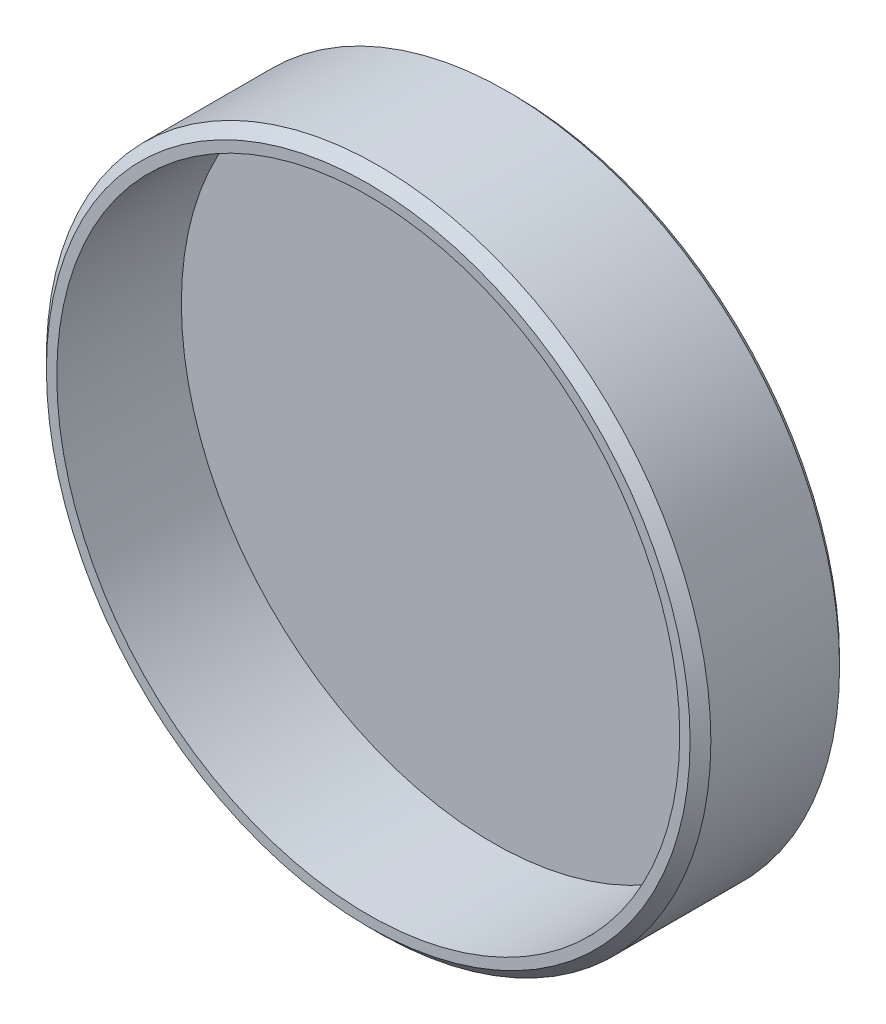
ISO-10303-21;
HEADER;
FILE_DESCRIPTION(('STEP AP214'),'2;1');
FILE_NAME('part.step','',(''),(''),'','','');
FILE_SCHEMA(('AUTOMOTIVE_DESIGN { 1 0 10303 214 1 1 1 1 }'));
ENDSEC;
DATA;
#1=APPLICATION_CONTEXT('core data for automotive mechanical design processes');
#2=APPLICATION_PROTOCOL_DEFINITION('international standard','automotive_design',2000,#1);
#3=PRODUCT_CONTEXT('',#1,'mechanical');
#4=PRODUCT('Part','Part','',(#3));
#5=PRODUCT_RELATED_PRODUCT_CATEGORY('part','',(#4));
#6=PRODUCT_DEFINITION_FORMATION('','',#4);
#7=PRODUCT_DEFINITION_CONTEXT('part definition',#1,'design');
#8=PRODUCT_DEFINITION('design','',#6,#7);
#9=PRODUCT_DEFINITION_SHAPE('','',#8);
#10=(LENGTH_UNIT() NAMED_UNIT(*) SI_UNIT(.MILLI.,.METRE.));
#11=(NAMED_UNIT(*) PLANE_ANGLE_UNIT() SI_UNIT($,.RADIAN.));
#12=(NAMED_UNIT(*) SI_UNIT($,.STERADIAN.) SOLID_ANGLE_UNIT());
#13=UNCERTAINTY_MEASURE_WITH_UNIT(LENGTH_MEASURE(1.E-05),#10,'distance_accuracy_value','');
#14=(GEOMETRIC_REPRESENTATION_CONTEXT(3) GLOBAL_UNCERTAINTY_ASSIGNED_CONTEXT((#13)) GLOBAL_UNIT_ASSIGNED_CONTEXT((#10,
#11,#12)) REPRESENTATION_CONTEXT('',''));
#15=CARTESIAN_POINT('',(0.,0.,0.));
#16=DIRECTION('',(0.,0.,1.));
#17=DIRECTION('',(1.,0.,0.));
#18=AXIS2_PLACEMENT_3D('',#15,#16,#17);
#19=CARTESIAN_POINT('',(0.,0.,7.));
#20=DIRECTION('',(0.,0.,-1.));
#21=DIRECTION('',(-1.,0.,0.));
#22=AXIS2_PLACEMENT_3D('',#19,#20,#21);
#23=CYLINDRICAL_SURFACE('',#22,16.);
#24=CARTESIAN_POINT('',(0.,0.,0.300000000000005));
#25=DIRECTION('',(0.,0.,1.));
#26=DIRECTION('',(1.,0.,0.));
#27=AXIS2_PLACEMENT_3D('',#24,#25,#26);
#28=CIRCLE('',#27,16.);
#29=CARTESIAN_POINT('',(16.,0.,0.300000000000005));
#30=VERTEX_POINT('',#29);
#31=EDGE_CURVE('E47',#30,#30,#28,.T.);
#32=ORIENTED_EDGE('',*,*,#31,.T.);
#33=EDGE_LOOP('',(#32));
#34=FACE_BOUND('',#33,.T.);
#35=CARTESIAN_POINT('',(0.,0.,6.5));
#36=DIRECTION('',(0.,0.,1.));
#37=DIRECTION('',(1.,0.,0.));
#38=AXIS2_PLACEMENT_3D('',#35,#36,#37);
#39=CIRCLE('',#38,16.);
#40=CARTESIAN_POINT('',(16.,0.,6.5));
#41=VERTEX_POINT('',#40);
#42=EDGE_CURVE('E53',#41,#41,#39,.F.);
#43=ORIENTED_EDGE('',*,*,#42,.T.);
#44=EDGE_LOOP('',(#43));
#45=FACE_BOUND('',#44,.T.);
#46=ADVANCED_FACE('F38',(#34,#45),#23,.T.);
#47=CARTESIAN_POINT('',(0.,0.,7.));
#48=DIRECTION('',(0.,0.,1.));
#49=DIRECTION('',(1.,0.,0.));
#50=AXIS2_PLACEMENT_3D('',#47,#48,#49);
#51=PLANE('',#50);
#52=CARTESIAN_POINT('',(0.,0.,7.));
#53=DIRECTION('',(0.,0.,1.));
#54=DIRECTION('',(1.,0.,0.));
#55=AXIS2_PLACEMENT_3D('',#52,#53,#54);
#56=CIRCLE('',#55,15.5);
#57=CARTESIAN_POINT('',(15.5,0.,7.));
#58=VERTEX_POINT('',#57);
#59=EDGE_CURVE('E58',#58,#58,#56,.T.);
#60=ORIENTED_EDGE('',*,*,#59,.T.);
#61=EDGE_LOOP('',(#60));
#62=FACE_BOUND('',#61,.T.);
#63=CARTESIAN_POINT('',(0.,0.,7.));
#64=DIRECTION('',(0.,0.,1.));
#65=DIRECTION('',(1.,0.,0.));
#66=AXIS2_PLACEMENT_3D('',#63,#64,#65);
#67=CIRCLE('',#66,15.);
#68=CARTESIAN_POINT('',(15.,0.,7.));
#69=VERTEX_POINT('',#68);
#70=EDGE_CURVE('E64',#69,#69,#67,.T.);
#71=ORIENTED_EDGE('',*,*,#70,.F.);
#72=EDGE_LOOP('',(#71));
#73=FACE_BOUND('',#72,.T.);
#74=ADVANCED_FACE('F92',(#62,#73),#51,.T.);
#75=CARTESIAN_POINT('',(0.,0.,0.));
#76=DIRECTION('',(0.,0.,1.));
#77=DIRECTION('',(1.,0.,0.));
#78=AXIS2_PLACEMENT_3D('',#75,#76,#77);
#79=PLANE('',#78);
#80=CARTESIAN_POINT('',(0.,0.,0.));
#81=DIRECTION('',(0.,0.,1.));
#82=DIRECTION('',(1.,0.,0.));
#83=AXIS2_PLACEMENT_3D('',#80,#81,#82);
#84=CIRCLE('',#83,15.7);
#85=CARTESIAN_POINT('',(15.7,0.,0.));
#86=VERTEX_POINT('',#85);
#87=EDGE_CURVE('E10',#86,#86,#84,.F.);
#88=ORIENTED_EDGE('',*,*,#87,.T.);
#89=EDGE_LOOP('',(#88));
#90=FACE_BOUND('',#89,.T.);
#91=CARTESIAN_POINT('',(0.,0.,0.));
#92=DIRECTION('',(0.,0.,-1.));
#93=DIRECTION('',(-1.,0.,0.));
#94=AXIS2_PLACEMENT_3D('',#91,#92,#93);
#95=CIRCLE('',#94,13.);
#96=CARTESIAN_POINT('',(-13.,0.,0.));
#97=VERTEX_POINT('',#96);
#98=EDGE_CURVE('E72',#97,#97,#95,.T.);
#99=ORIENTED_EDGE('',*,*,#98,.F.);
#100=EDGE_LOOP('',(#99));
#101=FACE_BOUND('',#100,.T.);
#102=ADVANCED_FACE('F89',(#90,#101),#79,.F.);
#103=CARTESIAN_POINT('',(0.,0.,7.));
#104=DIRECTION('',(0.,0.,-1.));
#105=DIRECTION('',(-1.,0.,0.));
#106=AXIS2_PLACEMENT_3D('',#103,#104,#105);
#107=CYLINDRICAL_SURFACE('',#106,15.);
#108=ORIENTED_EDGE('',*,*,#70,.T.);
#109=EDGE_LOOP('',(#108));
#110=FACE_BOUND('',#109,.T.);
#111=CARTESIAN_POINT('',(0.,0.,1.));
#112=DIRECTION('',(0.,0.,1.));
#113=DIRECTION('',(1.,0.,0.));
#114=AXIS2_PLACEMENT_3D('',#111,#112,#113);
#115=CIRCLE('',#114,15.);
#116=CARTESIAN_POINT('',(15.,0.,1.));
#117=VERTEX_POINT('',#116);
#118=EDGE_CURVE('E67',#117,#117,#115,.T.);
#119=ORIENTED_EDGE('',*,*,#118,.F.);
#120=EDGE_LOOP('',(#119));
#121=FACE_BOUND('',#120,.T.);
#122=ADVANCED_FACE('F91',(#110,#121),#107,.F.);
#123=CARTESIAN_POINT('',(0.,0.,1.));
#124=DIRECTION('',(0.,0.,1.));
#125=DIRECTION('',(1.,0.,0.));
#126=AXIS2_PLACEMENT_3D('',#123,#124,#125);
#127=PLANE('',#126);
#128=ORIENTED_EDGE('',*,*,#118,.T.);
#129=EDGE_LOOP('',(#128));
#130=FACE_BOUND('',#129,.T.);
#131=ADVANCED_FACE('F85',(#130),#127,.T.);
#132=CARTESIAN_POINT('',(0.,0.,0.1));
#133=DIRECTION('',(0.,0.,-1.));
#134=DIRECTION('',(-1.,0.,0.));
#135=AXIS2_PLACEMENT_3D('',#132,#133,#134);
#136=CYLINDRICAL_SURFACE('',#135,13.);
#137=CARTESIAN_POINT('',(0.,0.,0.1));
#138=DIRECTION('',(0.,0.,-1.));
#139=DIRECTION('',(-1.,0.,0.));
#140=AXIS2_PLACEMENT_3D('',#137,#138,#139);
#141=CIRCLE('',#140,13.);
#142=CARTESIAN_POINT('',(-13.,0.,0.1));
#143=VERTEX_POINT('',#142);
#144=EDGE_CURVE('E71',#143,#143,#141,.T.);
#145=ORIENTED_EDGE('',*,*,#144,.F.);
#146=EDGE_LOOP('',(#145));
#147=FACE_BOUND('',#146,.T.);
#148=ORIENTED_EDGE('',*,*,#98,.T.);
#149=EDGE_LOOP('',(#148));
#150=FACE_BOUND('',#149,.T.);
#151=ADVANCED_FACE('F82',(#147,#150),#136,.F.);
#152=CARTESIAN_POINT('',(0.,0.,0.1));
#153=DIRECTION('',(0.,0.,-1.));
#154=DIRECTION('',(-1.,0.,0.));
#155=AXIS2_PLACEMENT_3D('',#152,#153,#154);
#156=PLANE('',#155);
#157=ORIENTED_EDGE('',*,*,#144,.T.);
#158=EDGE_LOOP('',(#157));
#159=FACE_BOUND('',#158,.T.);
#160=ADVANCED_FACE('F80',(#159),#156,.T.);
#161=CARTESIAN_POINT('',(0.,0.,7.));
#162=DIRECTION('',(0.,0.,-1.));
#163=DIRECTION('',(-1.,0.,0.));
#164=AXIS2_PLACEMENT_3D('',#161,#162,#163);
#165=CONICAL_SURFACE('',#164,15.5,0.785398163397441);
#166=ORIENTED_EDGE('',*,*,#42,.F.);
#167=EDGE_LOOP('',(#166));
#168=FACE_BOUND('',#167,.T.);
#169=ORIENTED_EDGE('',*,*,#59,.F.);
#170=EDGE_LOOP('',(#169));
#171=FACE_BOUND('',#170,.T.);
#172=ADVANCED_FACE('F108',(#168,#171),#165,.T.);
#173=CARTESIAN_POINT('',(0.,0.,0.300000000000005));
#174=DIRECTION('',(0.,0.,1.));
#175=DIRECTION('',(1.,0.,0.));
#176=AXIS2_PLACEMENT_3D('',#173,#174,#175);
#177=CONICAL_SURFACE('',#176,16.,0.785398163397454);
#178=CARTESIAN_POINT('',(15.7,0.,0.));
#179=CARTESIAN_POINT('',(15.703125,0.,0.00312500000000081));
#180=CARTESIAN_POINT('',(15.70625,0.,0.0062500000000006));
#181=CARTESIAN_POINT('',(15.7125,0.,0.0125000000000002));
#182=CARTESIAN_POINT('',(15.715625,0.,0.015625));
#183=CARTESIAN_POINT('',(15.721875,0.,0.021875));
#184=CARTESIAN_POINT('',(15.725,0.,0.0250000000000002));
#185=CARTESIAN_POINT('',(15.73125,0.,0.0312500000000007));
#186=CARTESIAN_POINT('',(15.734375,0.,0.0343750000000009));
#187=CARTESIAN_POINT('',(15.740625,0.,0.0406250000000008));
#188=CARTESIAN_POINT('',(15.74375,0.,0.0437500000000004));
#189=CARTESIAN_POINT('',(15.75,0.,0.0500000000000005));
#190=CARTESIAN_POINT('',(15.753125,0.,0.0531250000000011));
#191=CARTESIAN_POINT('',(15.759375,0.,0.0593750000000012));
#192=CARTESIAN_POINT('',(15.7625,0.,0.0625000000000008));
#193=CARTESIAN_POINT('',(15.76875,0.,0.0687500000000007));
#194=CARTESIAN_POINT('',(15.771875,0.,0.071875000000001));
#195=CARTESIAN_POINT('',(15.778125,0.,0.0781250000000015));
#196=CARTESIAN_POINT('',(15.78125,0.,0.0812500000000017));
#197=CARTESIAN_POINT('',(15.7875,0.,0.0875000000000016));
#198=CARTESIAN_POINT('',(15.790625,0.,0.0906250000000013));
#199=CARTESIAN_POINT('',(15.796875,0.,0.0968750000000012));
#200=CARTESIAN_POINT('',(15.8,0.,0.100000000000001));
#201=CARTESIAN_POINT('',(15.80625,0.,0.106250000000002));
#202=CARTESIAN_POINT('',(15.809375,0.,0.109375000000002));
#203=CARTESIAN_POINT('',(15.815625,0.,0.115625000000002));
#204=CARTESIAN_POINT('',(15.81875,0.,0.118750000000002));
#205=CARTESIAN_POINT('',(15.825,0.,0.125000000000002));
#206=CARTESIAN_POINT('',(15.828125,0.,0.128125000000002));
#207=CARTESIAN_POINT('',(15.834375,0.,0.134375000000003));
#208=CARTESIAN_POINT('',(15.8375,0.,0.137500000000002));
#209=CARTESIAN_POINT('',(15.84375,0.,0.143750000000002));
#210=CARTESIAN_POINT('',(15.846875,0.,0.146875000000002));
#211=CARTESIAN_POINT('',(15.853125,0.,0.153125000000003));
#212=CARTESIAN_POINT('',(15.85625,0.,0.156250000000003));
#213=CARTESIAN_POINT('',(15.8625,0.,0.162500000000003));
#214=CARTESIAN_POINT('',(15.865625,0.,0.165625000000003));
#215=CARTESIAN_POINT('',(15.871875,0.,0.171875000000002));
#216=CARTESIAN_POINT('',(15.875,0.,0.175000000000003));
#217=CARTESIAN_POINT('',(15.88125,0.,0.181250000000003));
#218=CARTESIAN_POINT('',(15.884375,0.,0.184375000000004));
#219=CARTESIAN_POINT('',(15.890625,0.,0.190625000000003));
#220=CARTESIAN_POINT('',(15.89375,0.,0.193750000000003));
#221=CARTESIAN_POINT('',(15.9,0.,0.200000000000003));
#222=CARTESIAN_POINT('',(15.903125,0.,0.203125000000004));
#223=CARTESIAN_POINT('',(15.909375,0.,0.209375000000004));
#224=CARTESIAN_POINT('',(15.9125,0.,0.212500000000003));
#225=CARTESIAN_POINT('',(15.91875,0.,0.218750000000003));
#226=CARTESIAN_POINT('',(15.921875,0.,0.221875000000004));
#227=CARTESIAN_POINT('',(15.928125,0.,0.228125000000004));
#228=CARTESIAN_POINT('',(15.93125,0.,0.231250000000004));
#229=CARTESIAN_POINT('',(15.9375,0.,0.237500000000004));
#230=CARTESIAN_POINT('',(15.940625,0.,0.240625000000004));
#231=CARTESIAN_POINT('',(15.946875,0.,0.246875000000004));
#232=CARTESIAN_POINT('',(15.95,0.,0.250000000000004));
#233=CARTESIAN_POINT('',(15.95625,0.,0.256250000000005));
#234=CARTESIAN_POINT('',(15.959375,0.,0.259375000000005));
#235=CARTESIAN_POINT('',(15.965625,0.,0.265625000000005));
#236=CARTESIAN_POINT('',(15.96875,0.,0.268750000000004));
#237=CARTESIAN_POINT('',(15.975,0.,0.275000000000004));
#238=CARTESIAN_POINT('',(15.978125,0.,0.278125000000005));
#239=CARTESIAN_POINT('',(15.984375,0.,0.284375000000005));
#240=CARTESIAN_POINT('',(15.9875,0.,0.287500000000005));
#241=CARTESIAN_POINT('',(15.99375,0.,0.293750000000004));
#242=CARTESIAN_POINT('',(15.996875,0.,0.296875000000004));
#243=CARTESIAN_POINT('',(16.,0.,0.300000000000005));
#244=B_SPLINE_CURVE_WITH_KNOTS('',3,(#178,#179,#180,#181,#182,#183,#184,#185,#186,#187,#188,
#189,#190,#191,#192,#193,#194,#195,#196,#197,#198,#199,#200,#201,#202,#203,#204,#205,#206,#207,
#208,#209,#210,#211,#212,#213,#214,#215,#216,#217,#218,#219,#220,#221,#222,#223,#224,#225,#226,
#227,#228,#229,#230,#231,#232,#233,#234,#235,#236,#237,#238,#239,#240,#241,#242,#243),
.UNSPECIFIED.,.F.,.F.,(4,2,2,2,2,2,2,2,2,2,2,2,2,2,2,2,2,2,2,2,2,2,2,2,2,2,2,2,2,2,2,2,4),(0.,
0.0132582521472471,0.0265165042944967,0.0397747564417439,0.053033008588991,0.0662912607362407,
0.0795495128834878,0.0928077650307374,0.106066017177985,0.119324269325232,0.132582521472481,
0.145840773619728,0.159099025766976,0.172357277914225,0.185615530061472,0.198873782208722,
0.212132034355969,0.225390286503216,0.238648538650466,0.251906790797713,0.26516504294496,
0.27842329509221,0.291681547239457,0.304939799386707,0.318198051533954,0.331456303681201,
0.34471455582845,0.357972807975698,0.371231060122945,0.384489312270194,0.397747564417441,
0.411005816564691,0.424264068711938),.UNSPECIFIED.);
#245=EDGE_CURVE('BSEAM41',#86,#30,#244,.T.);
#246=ORIENTED_EDGE('',*,*,#87,.F.);
#247=ORIENTED_EDGE('',*,*,#31,.F.);
#248=ORIENTED_EDGE('',*,*,#245,.T.);
#249=ORIENTED_EDGE('',*,*,#245,.F.);
#250=EDGE_LOOP('',(#246,#248,#247,#249));
#251=FACE_BOUND('',#250,.T.);
#252=ADVANCED_FACE('F41',(#251),#177,.T.);
#253=CLOSED_SHELL('',(#46,#74,#102,#122,#131,#151,#160,#172,#252));
#254=MANIFOLD_SOLID_BREP('B2',#253);
#255=ADVANCED_BREP_SHAPE_REPRESENTATION('',(#18,#254),#14);
#256=SHAPE_DEFINITION_REPRESENTATION(#9,#255);
ENDSEC;
END-ISO-10303-21;
